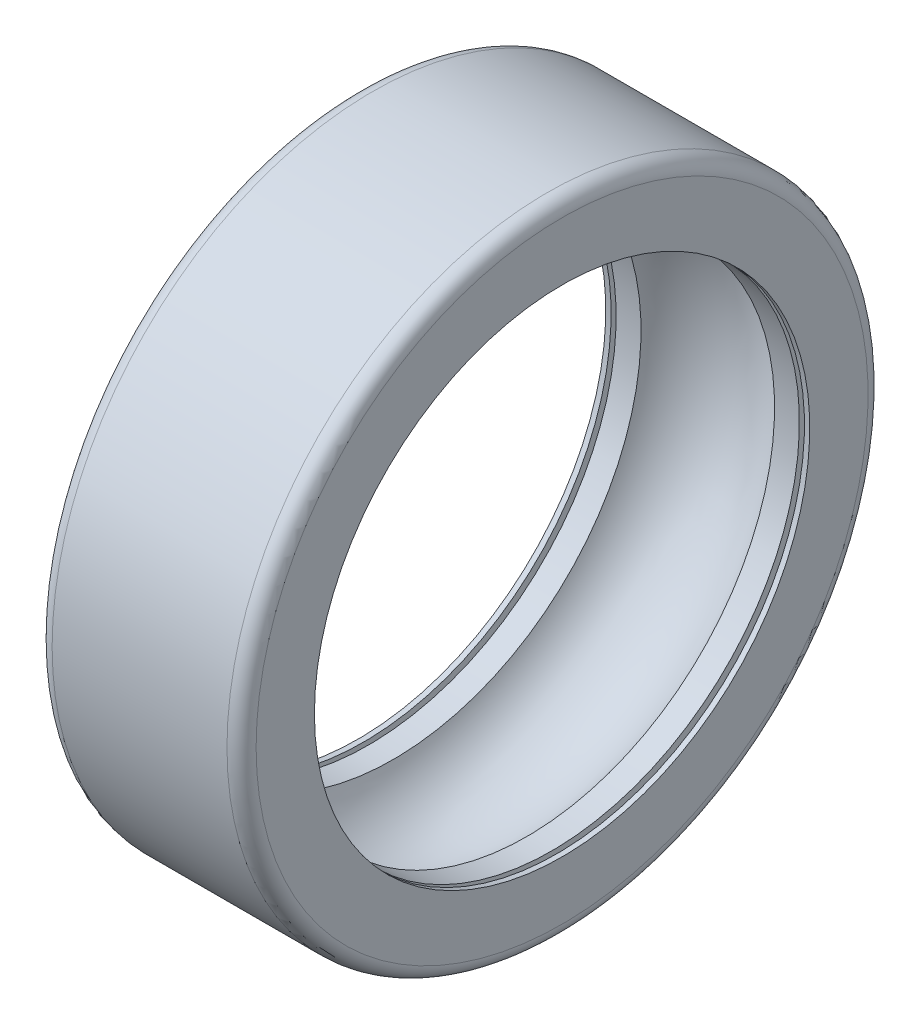
ISO-10303-21;
HEADER;
FILE_DESCRIPTION(('STEP AP214'),'2;1');
FILE_NAME('part.step','',(''),(''),'','','');
FILE_SCHEMA(('AUTOMOTIVE_DESIGN { 1 0 10303 214 1 1 1 1 }'));
ENDSEC;
DATA;
#1=APPLICATION_CONTEXT('core data for automotive mechanical design processes');
#2=APPLICATION_PROTOCOL_DEFINITION('international standard','automotive_design',2000,#1);
#3=PRODUCT_CONTEXT('',#1,'mechanical');
#4=PRODUCT('Part','Part','',(#3));
#5=PRODUCT_RELATED_PRODUCT_CATEGORY('part','',(#4));
#6=PRODUCT_DEFINITION_FORMATION('','',#4);
#7=PRODUCT_DEFINITION_CONTEXT('part definition',#1,'design');
#8=PRODUCT_DEFINITION('design','',#6,#7);
#9=PRODUCT_DEFINITION_SHAPE('','',#8);
#10=(LENGTH_UNIT() NAMED_UNIT(*) SI_UNIT(.MILLI.,.METRE.));
#11=(NAMED_UNIT(*) PLANE_ANGLE_UNIT() SI_UNIT($,.RADIAN.));
#12=(NAMED_UNIT(*) SI_UNIT($,.STERADIAN.) SOLID_ANGLE_UNIT());
#13=UNCERTAINTY_MEASURE_WITH_UNIT(LENGTH_MEASURE(1.E-05),#10,'distance_accuracy_value','');
#14=(GEOMETRIC_REPRESENTATION_CONTEXT(3) GLOBAL_UNCERTAINTY_ASSIGNED_CONTEXT((#13)) GLOBAL_UNIT_ASSIGNED_CONTEXT((#10,
#11,#12)) REPRESENTATION_CONTEXT('',''));
#15=CARTESIAN_POINT('',(0.,0.,0.));
#16=DIRECTION('',(0.,0.,1.));
#17=DIRECTION('',(1.,0.,0.));
#18=AXIS2_PLACEMENT_3D('',#15,#16,#17);
#19=CARTESIAN_POINT('',(8.80066945939519,0.,0.));
#20=DIRECTION('',(-1.,0.,0.));
#21=DIRECTION('',(0.,0.,1.));
#22=AXIS2_PLACEMENT_3D('',#19,#20,#21);
#23=CYLINDRICAL_SURFACE('',#22,8.5);
#24=CARTESIAN_POINT('',(19.1319248867625,0.,0.));
#25=DIRECTION('',(-1.,0.,0.));
#26=DIRECTION('',(0.,0.,1.));
#27=AXIS2_PLACEMENT_3D('',#24,#25,#26);
#28=CIRCLE('',#27,8.5);
#29=CARTESIAN_POINT('',(19.1319248867625,0.,8.5));
#30=VERTEX_POINT('',#29);
#31=EDGE_CURVE('E10',#30,#30,#28,.T.);
#32=ORIENTED_EDGE('',*,*,#31,.F.);
#33=EDGE_LOOP('',(#32));
#34=FACE_BOUND('',#33,.T.);
#35=CARTESIAN_POINT('',(18.9491618386922,0.,0.));
#36=DIRECTION('',(-1.,0.,0.));
#37=DIRECTION('',(0.,0.,1.));
#38=AXIS2_PLACEMENT_3D('',#35,#36,#37);
#39=CIRCLE('',#38,8.5);
#40=CARTESIAN_POINT('',(18.9491618386922,0.,8.5));
#41=VERTEX_POINT('',#40);
#42=EDGE_CURVE('E85',#41,#41,#39,.T.);
#43=ORIENTED_EDGE('',*,*,#42,.T.);
#44=EDGE_LOOP('',(#43));
#45=FACE_BOUND('',#44,.T.);
#46=ADVANCED_FACE('F33',(#34,#45),#23,.F.);
#47=CARTESIAN_POINT('',(19.1319248867625,10.5,0.));
#48=DIRECTION('',(-1.,0.,0.));
#49=DIRECTION('',(0.,0.,1.));
#50=AXIS2_PLACEMENT_3D('',#47,#48,#49);
#51=PLANE('',#50);
#52=CARTESIAN_POINT('',(19.1319248867625,0.,0.));
#53=DIRECTION('',(-1.,0.,0.));
#54=DIRECTION('',(0.,0.,1.));
#55=AXIS2_PLACEMENT_3D('',#52,#53,#54);
#56=CIRCLE('',#55,10.5);
#57=CARTESIAN_POINT('',(19.1319248867625,0.,10.5));
#58=VERTEX_POINT('',#57);
#59=EDGE_CURVE('E39',#58,#58,#56,.T.);
#60=ORIENTED_EDGE('',*,*,#59,.F.);
#61=EDGE_LOOP('',(#60));
#62=FACE_BOUND('',#61,.T.);
#63=ORIENTED_EDGE('',*,*,#31,.T.);
#64=EDGE_LOOP('',(#63));
#65=FACE_BOUND('',#64,.T.);
#66=ADVANCED_FACE('F170',(#62,#65),#51,.F.);
#67=CARTESIAN_POINT('',(18.6319248867625,0.,0.));
#68=DIRECTION('',(-1.,0.,0.));
#69=DIRECTION('',(0.,0.,1.));
#70=AXIS2_PLACEMENT_3D('',#67,#68,#69);
#71=TOROIDAL_SURFACE('',#70,10.5,0.5);
#72=CARTESIAN_POINT('',(18.6319248867625,0.,0.));
#73=DIRECTION('',(-1.,0.,0.));
#74=DIRECTION('',(0.,0.,1.));
#75=AXIS2_PLACEMENT_3D('',#72,#73,#74);
#76=CIRCLE('',#75,11.);
#77=CARTESIAN_POINT('',(18.6319248867625,0.,11.));
#78=VERTEX_POINT('',#77);
#79=EDGE_CURVE('E43',#78,#78,#76,.T.);
#80=ORIENTED_EDGE('',*,*,#79,.F.);
#81=EDGE_LOOP('',(#80));
#82=FACE_BOUND('',#81,.T.);
#83=ORIENTED_EDGE('',*,*,#59,.T.);
#84=EDGE_LOOP('',(#83));
#85=FACE_BOUND('',#84,.T.);
#86=ADVANCED_FACE('F165',(#82,#85),#71,.T.);
#87=CARTESIAN_POINT('',(8.80066945939519,0.,0.));
#88=DIRECTION('',(-1.,0.,0.));
#89=DIRECTION('',(0.,0.,1.));
#90=AXIS2_PLACEMENT_3D('',#87,#88,#89);
#91=CYLINDRICAL_SURFACE('',#90,11.);
#92=CARTESIAN_POINT('',(12.6319248867625,0.,0.));
#93=DIRECTION('',(-1.,0.,0.));
#94=DIRECTION('',(0.,0.,1.));
#95=AXIS2_PLACEMENT_3D('',#92,#93,#94);
#96=CIRCLE('',#95,11.);
#97=CARTESIAN_POINT('',(12.6319248867625,0.,11.));
#98=VERTEX_POINT('',#97);
#99=EDGE_CURVE('E47',#98,#98,#96,.T.);
#100=ORIENTED_EDGE('',*,*,#99,.F.);
#101=EDGE_LOOP('',(#100));
#102=FACE_BOUND('',#101,.T.);
#103=ORIENTED_EDGE('',*,*,#79,.T.);
#104=EDGE_LOOP('',(#103));
#105=FACE_BOUND('',#104,.T.);
#106=ADVANCED_FACE('F159',(#102,#105),#91,.T.);
#107=CARTESIAN_POINT('',(12.6319248867625,0.,0.));
#108=DIRECTION('',(-1.,0.,0.));
#109=DIRECTION('',(0.,0.,1.));
#110=AXIS2_PLACEMENT_3D('',#107,#108,#109);
#111=TOROIDAL_SURFACE('',#110,10.5,0.5);
#112=CARTESIAN_POINT('',(12.1319248867625,0.,0.));
#113=DIRECTION('',(-1.,0.,0.));
#114=DIRECTION('',(0.,0.,1.));
#115=AXIS2_PLACEMENT_3D('',#112,#113,#114);
#116=CIRCLE('',#115,10.5);
#117=CARTESIAN_POINT('',(12.1319248867625,0.,10.5));
#118=VERTEX_POINT('',#117);
#119=EDGE_CURVE('E52',#118,#118,#116,.T.);
#120=ORIENTED_EDGE('',*,*,#119,.F.);
#121=EDGE_LOOP('',(#120));
#122=FACE_BOUND('',#121,.T.);
#123=ORIENTED_EDGE('',*,*,#99,.T.);
#124=EDGE_LOOP('',(#123));
#125=FACE_BOUND('',#124,.T.);
#126=ADVANCED_FACE('F153',(#122,#125),#111,.T.);
#127=CARTESIAN_POINT('',(12.1319248867625,10.5,0.));
#128=DIRECTION('',(1.,0.,0.));
#129=DIRECTION('',(0.,0.,-1.));
#130=AXIS2_PLACEMENT_3D('',#127,#128,#129);
#131=PLANE('',#130);
#132=CARTESIAN_POINT('',(12.1319248867625,0.,0.));
#133=DIRECTION('',(-1.,0.,0.));
#134=DIRECTION('',(0.,0.,1.));
#135=AXIS2_PLACEMENT_3D('',#132,#133,#134);
#136=CIRCLE('',#135,8.5);
#137=CARTESIAN_POINT('',(12.1319248867625,0.,8.5));
#138=VERTEX_POINT('',#137);
#139=EDGE_CURVE('E55',#138,#138,#136,.T.);
#140=ORIENTED_EDGE('',*,*,#139,.F.);
#141=EDGE_LOOP('',(#140));
#142=FACE_BOUND('',#141,.T.);
#143=ORIENTED_EDGE('',*,*,#119,.T.);
#144=EDGE_LOOP('',(#143));
#145=FACE_BOUND('',#144,.T.);
#146=ADVANCED_FACE('F147',(#142,#145),#131,.F.);
#147=CARTESIAN_POINT('',(8.80066945939519,0.,0.));
#148=DIRECTION('',(-1.,0.,0.));
#149=DIRECTION('',(0.,0.,1.));
#150=AXIS2_PLACEMENT_3D('',#147,#148,#149);
#151=CYLINDRICAL_SURFACE('',#150,8.5);
#152=CARTESIAN_POINT('',(12.3146879348327,0.,0.));
#153=DIRECTION('',(-1.,0.,0.));
#154=DIRECTION('',(0.,0.,1.));
#155=AXIS2_PLACEMENT_3D('',#152,#153,#154);
#156=CIRCLE('',#155,8.5);
#157=CARTESIAN_POINT('',(12.3146879348327,0.,8.5));
#158=VERTEX_POINT('',#157);
#159=EDGE_CURVE('E58',#158,#158,#156,.T.);
#160=ORIENTED_EDGE('',*,*,#159,.F.);
#161=EDGE_LOOP('',(#160));
#162=FACE_BOUND('',#161,.T.);
#163=ORIENTED_EDGE('',*,*,#139,.T.);
#164=EDGE_LOOP('',(#163));
#165=FACE_BOUND('',#164,.T.);
#166=ADVANCED_FACE('F141',(#162,#165),#151,.F.);
#167=CARTESIAN_POINT('',(12.3146879348327,8.5,0.));
#168=DIRECTION('',(-1.,0.,0.));
#169=DIRECTION('',(0.,0.,1.));
#170=AXIS2_PLACEMENT_3D('',#167,#168,#169);
#171=PLANE('',#170);
#172=CARTESIAN_POINT('',(12.3146879348327,0.,0.));
#173=DIRECTION('',(-1.,0.,0.));
#174=DIRECTION('',(0.,0.,1.));
#175=AXIS2_PLACEMENT_3D('',#172,#173,#174);
#176=CIRCLE('',#175,8.80403990897219);
#177=CARTESIAN_POINT('',(12.3146879348327,0.,8.80403990897219));
#178=VERTEX_POINT('',#177);
#179=EDGE_CURVE('E61',#178,#178,#176,.T.);
#180=ORIENTED_EDGE('',*,*,#179,.F.);
#181=EDGE_LOOP('',(#180));
#182=FACE_BOUND('',#181,.T.);
#183=ORIENTED_EDGE('',*,*,#159,.T.);
#184=EDGE_LOOP('',(#183));
#185=FACE_BOUND('',#184,.T.);
#186=ADVANCED_FACE('F135',(#182,#185),#171,.F.);
#187=CARTESIAN_POINT('',(8.80066945939519,0.,0.));
#188=DIRECTION('',(-1.,0.,0.));
#189=DIRECTION('',(0.,0.,1.));
#190=AXIS2_PLACEMENT_3D('',#187,#188,#189);
#191=CYLINDRICAL_SURFACE('',#190,8.80403990897219);
#192=CARTESIAN_POINT('',(12.4874857833424,0.,0.));
#193=DIRECTION('',(-1.,0.,0.));
#194=DIRECTION('',(0.,0.,1.));
#195=AXIS2_PLACEMENT_3D('',#192,#193,#194);
#196=CIRCLE('',#195,8.80403990897219);
#197=CARTESIAN_POINT('',(12.4874857833424,0.,8.80403990897219));
#198=VERTEX_POINT('',#197);
#199=EDGE_CURVE('E64',#198,#198,#196,.T.);
#200=ORIENTED_EDGE('',*,*,#199,.F.);
#201=EDGE_LOOP('',(#200));
#202=FACE_BOUND('',#201,.T.);
#203=ORIENTED_EDGE('',*,*,#179,.T.);
#204=EDGE_LOOP('',(#203));
#205=FACE_BOUND('',#204,.T.);
#206=ADVANCED_FACE('F129',(#202,#205),#191,.F.);
#207=CARTESIAN_POINT('',(12.4874857833424,8.80403990897219,0.));
#208=DIRECTION('',(1.,0.,0.));
#209=DIRECTION('',(0.,0.,-1.));
#210=AXIS2_PLACEMENT_3D('',#207,#208,#209);
#211=PLANE('',#210);
#212=CARTESIAN_POINT('',(12.4874857833424,0.,0.));
#213=DIRECTION('',(-1.,0.,0.));
#214=DIRECTION('',(0.,0.,1.));
#215=AXIS2_PLACEMENT_3D('',#212,#213,#214);
#216=CIRCLE('',#215,8.49999999999998);
#217=CARTESIAN_POINT('',(12.4874857833424,0.,8.49999999999998));
#218=VERTEX_POINT('',#217);
#219=EDGE_CURVE('E67',#218,#218,#216,.T.);
#220=ORIENTED_EDGE('',*,*,#219,.F.);
#221=EDGE_LOOP('',(#220));
#222=FACE_BOUND('',#221,.T.);
#223=ORIENTED_EDGE('',*,*,#199,.T.);
#224=EDGE_LOOP('',(#223));
#225=FACE_BOUND('',#224,.T.);
#226=ADVANCED_FACE('F123',(#222,#225),#211,.F.);
#227=CARTESIAN_POINT('',(8.80066945939519,0.,0.));
#228=DIRECTION('',(-1.,0.,0.));
#229=DIRECTION('',(0.,0.,1.));
#230=AXIS2_PLACEMENT_3D('',#227,#228,#229);
#231=CYLINDRICAL_SURFACE('',#230,8.49999999999999);
#232=CARTESIAN_POINT('',(13.3406370392845,0.,0.));
#233=DIRECTION('',(-1.,0.,0.));
#234=DIRECTION('',(0.,0.,1.));
#235=AXIS2_PLACEMENT_3D('',#232,#233,#234);
#236=CIRCLE('',#235,8.5);
#237=CARTESIAN_POINT('',(13.3406370392845,0.,8.5));
#238=VERTEX_POINT('',#237);
#239=EDGE_CURVE('E70',#238,#238,#236,.T.);
#240=ORIENTED_EDGE('',*,*,#239,.F.);
#241=EDGE_LOOP('',(#240));
#242=FACE_BOUND('',#241,.T.);
#243=ORIENTED_EDGE('',*,*,#219,.T.);
#244=EDGE_LOOP('',(#243));
#245=FACE_BOUND('',#244,.T.);
#246=ADVANCED_FACE('F117',(#242,#245),#231,.F.);
#247=CARTESIAN_POINT('',(15.6319248867625,0.,0.));
#248=DIRECTION('',(-1.,0.,0.));
#249=DIRECTION('',(0.,0.,1.));
#250=AXIS2_PLACEMENT_3D('',#247,#248,#249);
#251=TOROIDAL_SURFACE('',#250,7.5,2.5);
#252=CARTESIAN_POINT('',(17.9232127342404,0.,0.));
#253=DIRECTION('',(-1.,0.,0.));
#254=DIRECTION('',(0.,0.,1.));
#255=AXIS2_PLACEMENT_3D('',#252,#253,#254);
#256=CIRCLE('',#255,8.5);
#257=CARTESIAN_POINT('',(17.9232127342404,0.,8.5));
#258=VERTEX_POINT('',#257);
#259=EDGE_CURVE('E73',#258,#258,#256,.T.);
#260=ORIENTED_EDGE('',*,*,#259,.F.);
#261=EDGE_LOOP('',(#260));
#262=FACE_BOUND('',#261,.T.);
#263=ORIENTED_EDGE('',*,*,#239,.T.);
#264=EDGE_LOOP('',(#263));
#265=FACE_BOUND('',#264,.T.);
#266=ADVANCED_FACE('F111',(#262,#265),#251,.F.);
#267=CARTESIAN_POINT('',(8.80066945939519,0.,0.));
#268=DIRECTION('',(-1.,0.,0.));
#269=DIRECTION('',(0.,0.,1.));
#270=AXIS2_PLACEMENT_3D('',#267,#268,#269);
#271=CYLINDRICAL_SURFACE('',#270,8.49999999999999);
#272=CARTESIAN_POINT('',(18.7763639901825,0.,0.));
#273=DIRECTION('',(-1.,0.,0.));
#274=DIRECTION('',(0.,0.,1.));
#275=AXIS2_PLACEMENT_3D('',#272,#273,#274);
#276=CIRCLE('',#275,8.49999999999998);
#277=CARTESIAN_POINT('',(18.7763639901825,0.,8.49999999999998));
#278=VERTEX_POINT('',#277);
#279=EDGE_CURVE('E76',#278,#278,#276,.T.);
#280=ORIENTED_EDGE('',*,*,#279,.F.);
#281=EDGE_LOOP('',(#280));
#282=FACE_BOUND('',#281,.T.);
#283=ORIENTED_EDGE('',*,*,#259,.T.);
#284=EDGE_LOOP('',(#283));
#285=FACE_BOUND('',#284,.T.);
#286=ADVANCED_FACE('F105',(#282,#285),#271,.F.);
#287=CARTESIAN_POINT('',(18.7763639901825,8.80403990897219,0.));
#288=DIRECTION('',(-1.,0.,0.));
#289=DIRECTION('',(0.,0.,1.));
#290=AXIS2_PLACEMENT_3D('',#287,#288,#289);
#291=PLANE('',#290);
#292=CARTESIAN_POINT('',(18.7763639901825,0.,0.));
#293=DIRECTION('',(-1.,0.,0.));
#294=DIRECTION('',(0.,0.,1.));
#295=AXIS2_PLACEMENT_3D('',#292,#293,#294);
#296=CIRCLE('',#295,8.80403990897219);
#297=CARTESIAN_POINT('',(18.7763639901825,0.,8.80403990897219));
#298=VERTEX_POINT('',#297);
#299=EDGE_CURVE('E79',#298,#298,#296,.T.);
#300=ORIENTED_EDGE('',*,*,#299,.F.);
#301=EDGE_LOOP('',(#300));
#302=FACE_BOUND('',#301,.T.);
#303=ORIENTED_EDGE('',*,*,#279,.T.);
#304=EDGE_LOOP('',(#303));
#305=FACE_BOUND('',#304,.T.);
#306=ADVANCED_FACE('F99',(#302,#305),#291,.F.);
#307=CARTESIAN_POINT('',(8.80066945939519,0.,0.));
#308=DIRECTION('',(-1.,0.,0.));
#309=DIRECTION('',(0.,0.,1.));
#310=AXIS2_PLACEMENT_3D('',#307,#308,#309);
#311=CYLINDRICAL_SURFACE('',#310,8.80403990897219);
#312=CARTESIAN_POINT('',(18.9491618386922,0.,0.));
#313=DIRECTION('',(-1.,0.,0.));
#314=DIRECTION('',(0.,0.,1.));
#315=AXIS2_PLACEMENT_3D('',#312,#313,#314);
#316=CIRCLE('',#315,8.80403990897219);
#317=CARTESIAN_POINT('',(18.9491618386922,0.,8.80403990897219));
#318=VERTEX_POINT('',#317);
#319=EDGE_CURVE('E82',#318,#318,#316,.T.);
#320=ORIENTED_EDGE('',*,*,#319,.F.);
#321=EDGE_LOOP('',(#320));
#322=FACE_BOUND('',#321,.T.);
#323=ORIENTED_EDGE('',*,*,#299,.T.);
#324=EDGE_LOOP('',(#323));
#325=FACE_BOUND('',#324,.T.);
#326=ADVANCED_FACE('F93',(#322,#325),#311,.F.);
#327=CARTESIAN_POINT('',(18.9491618386922,8.5,0.));
#328=DIRECTION('',(1.,0.,0.));
#329=DIRECTION('',(0.,0.,-1.));
#330=AXIS2_PLACEMENT_3D('',#327,#328,#329);
#331=PLANE('',#330);
#332=ORIENTED_EDGE('',*,*,#42,.F.);
#333=EDGE_LOOP('',(#332));
#334=FACE_BOUND('',#333,.T.);
#335=ORIENTED_EDGE('',*,*,#319,.T.);
#336=EDGE_LOOP('',(#335));
#337=FACE_BOUND('',#336,.T.);
#338=ADVANCED_FACE('F90',(#334,#337),#331,.F.);
#339=CLOSED_SHELL('',(#46,#66,#86,#106,#126,#146,#166,#186,#206,#226,#246,#266,#286,#306,#326,#338));
#340=MANIFOLD_SOLID_BREP('B2',#339);
#341=ADVANCED_BREP_SHAPE_REPRESENTATION('',(#18,#340),#14);
#342=SHAPE_DEFINITION_REPRESENTATION(#9,#341);
ENDSEC;
END-ISO-10303-21;
